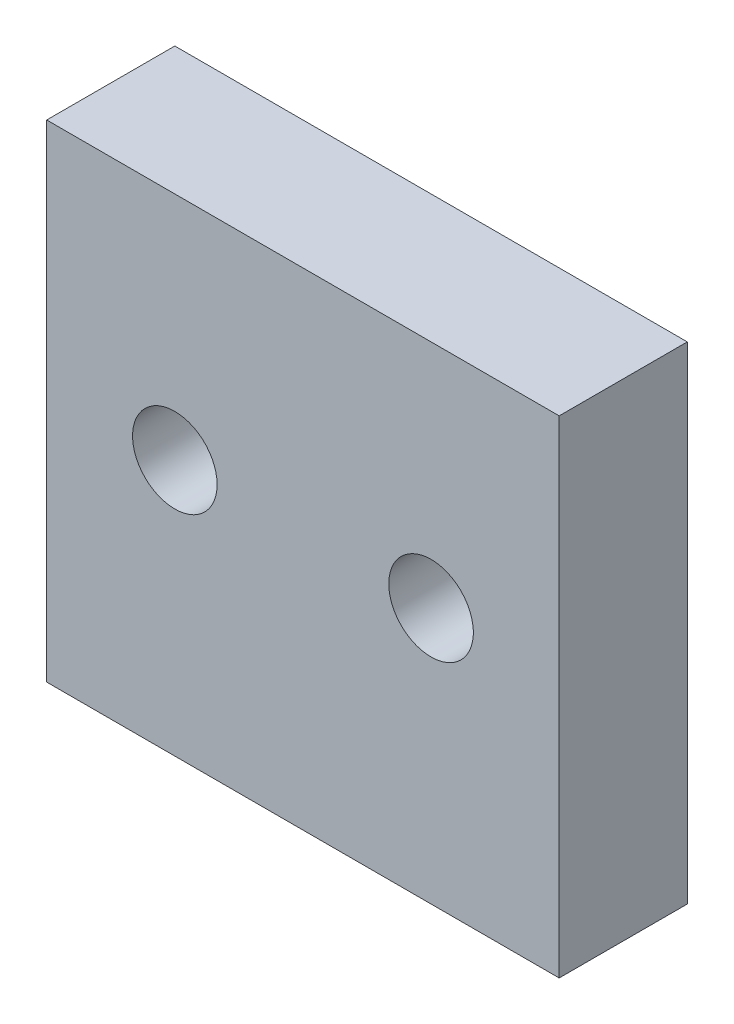
ISO-10303-21;
HEADER;
FILE_DESCRIPTION(('STEP AP214'),'2;1');
FILE_NAME('part.step','',(''),(''),'','','');
FILE_SCHEMA(('AUTOMOTIVE_DESIGN { 1 0 10303 214 1 1 1 1 }'));
ENDSEC;
DATA;
#1=APPLICATION_CONTEXT('core data for automotive mechanical design processes');
#2=APPLICATION_PROTOCOL_DEFINITION('international standard','automotive_design',2000,#1);
#3=PRODUCT_CONTEXT('',#1,'mechanical');
#4=PRODUCT('Part','Part','',(#3));
#5=PRODUCT_RELATED_PRODUCT_CATEGORY('part','',(#4));
#6=PRODUCT_DEFINITION_FORMATION('','',#4);
#7=PRODUCT_DEFINITION_CONTEXT('part definition',#1,'design');
#8=PRODUCT_DEFINITION('design','',#6,#7);
#9=PRODUCT_DEFINITION_SHAPE('','',#8);
#10=(LENGTH_UNIT() NAMED_UNIT(*) SI_UNIT(.MILLI.,.METRE.));
#11=(NAMED_UNIT(*) PLANE_ANGLE_UNIT() SI_UNIT($,.RADIAN.));
#12=(NAMED_UNIT(*) SI_UNIT($,.STERADIAN.) SOLID_ANGLE_UNIT());
#13=UNCERTAINTY_MEASURE_WITH_UNIT(LENGTH_MEASURE(1.E-05),#10,'distance_accuracy_value','');
#14=(GEOMETRIC_REPRESENTATION_CONTEXT(3) GLOBAL_UNCERTAINTY_ASSIGNED_CONTEXT((#13)) GLOBAL_UNIT_ASSIGNED_CONTEXT((#10,
#11,#12)) REPRESENTATION_CONTEXT('',''));
#15=CARTESIAN_POINT('',(0.,0.,0.));
#16=DIRECTION('',(0.,0.,1.));
#17=DIRECTION('',(1.,0.,0.));
#18=AXIS2_PLACEMENT_3D('',#15,#16,#17);
#19=CARTESIAN_POINT('',(0.,0.,5.));
#20=DIRECTION('',(0.,0.,1.));
#21=DIRECTION('',(1.,0.,0.));
#22=AXIS2_PLACEMENT_3D('',#19,#20,#21);
#23=PLANE('',#22);
#24=DIRECTION('',(1.,0.,0.));
#25=VECTOR('',#24,1.);
#26=CARTESIAN_POINT('',(-10.,9.,5.));
#27=LINE('',#26,#25);
#28=CARTESIAN_POINT('',(-10.,9.,5.));
#29=VERTEX_POINT('',#28);
#30=CARTESIAN_POINT('',(10.,9.,5.));
#31=VERTEX_POINT('',#30);
#32=EDGE_CURVE('E117',#29,#31,#27,.T.);
#33=ORIENTED_EDGE('',*,*,#32,.F.);
#34=DIRECTION('',(0.,-1.,0.));
#35=VECTOR('',#34,1.);
#36=CARTESIAN_POINT('',(-10.,10.,5.));
#37=LINE('',#36,#35);
#38=CARTESIAN_POINT('',(-10.,-10.,5.));
#39=VERTEX_POINT('',#38);
#40=EDGE_CURVE('E102',#29,#39,#37,.T.);
#41=ORIENTED_EDGE('',*,*,#40,.T.);
#42=DIRECTION('',(1.,0.,0.));
#43=VECTOR('',#42,1.);
#44=CARTESIAN_POINT('',(-10.,-10.,5.));
#45=LINE('',#44,#43);
#46=CARTESIAN_POINT('',(10.,-10.,5.));
#47=VERTEX_POINT('',#46);
#48=EDGE_CURVE('E65',#39,#47,#45,.T.);
#49=ORIENTED_EDGE('',*,*,#48,.T.);
#50=DIRECTION('',(0.,1.,0.));
#51=VECTOR('',#50,1.);
#52=CARTESIAN_POINT('',(10.,10.,5.));
#53=LINE('',#52,#51);
#54=EDGE_CURVE('E85',#47,#31,#53,.T.);
#55=ORIENTED_EDGE('',*,*,#54,.T.);
#56=EDGE_LOOP('',(#33,#41,#49,#55));
#57=FACE_BOUND('',#56,.T.);
#58=CARTESIAN_POINT('',(-5.,0.,5.));
#59=DIRECTION('',(0.,0.,1.));
#60=DIRECTION('',(1.,0.,0.));
#61=AXIS2_PLACEMENT_3D('',#58,#59,#60);
#62=CIRCLE('',#61,1.65);
#63=CARTESIAN_POINT('',(-3.35,0.,5.));
#64=VERTEX_POINT('',#63);
#65=EDGE_CURVE('E94',#64,#64,#62,.T.);
#66=ORIENTED_EDGE('',*,*,#65,.F.);
#67=EDGE_LOOP('',(#66));
#68=FACE_BOUND('',#67,.T.);
#69=CARTESIAN_POINT('',(5.,0.,5.));
#70=DIRECTION('',(0.,0.,1.));
#71=DIRECTION('',(-1.,0.,0.));
#72=AXIS2_PLACEMENT_3D('',#69,#70,#71);
#73=CIRCLE('',#72,1.65);
#74=CARTESIAN_POINT('',(3.35,0.,5.));
#75=VERTEX_POINT('',#74);
#76=EDGE_CURVE('E106',#75,#75,#73,.T.);
#77=ORIENTED_EDGE('',*,*,#76,.F.);
#78=EDGE_LOOP('',(#77));
#79=FACE_BOUND('',#78,.T.);
#80=ADVANCED_FACE('F41',(#57,#68,#79),#23,.T.);
#81=CARTESIAN_POINT('',(0.,0.,0.));
#82=DIRECTION('',(0.,0.,1.));
#83=DIRECTION('',(1.,0.,0.));
#84=AXIS2_PLACEMENT_3D('',#81,#82,#83);
#85=PLANE('',#84);
#86=DIRECTION('',(0.,-1.,0.));
#87=VECTOR('',#86,1.);
#88=CARTESIAN_POINT('',(-10.,10.,0.));
#89=LINE('',#88,#87);
#90=CARTESIAN_POINT('',(-10.,9.,0.));
#91=VERTEX_POINT('',#90);
#92=CARTESIAN_POINT('',(-10.,-10.,0.));
#93=VERTEX_POINT('',#92);
#94=EDGE_CURVE('E86',#91,#93,#89,.T.);
#95=ORIENTED_EDGE('',*,*,#94,.F.);
#96=DIRECTION('',(1.,0.,0.));
#97=VECTOR('',#96,1.);
#98=CARTESIAN_POINT('',(-10.,9.,0.));
#99=LINE('',#98,#97);
#100=CARTESIAN_POINT('',(10.,9.,0.));
#101=VERTEX_POINT('',#100);
#102=EDGE_CURVE('E56',#91,#101,#99,.T.);
#103=ORIENTED_EDGE('',*,*,#102,.T.);
#104=DIRECTION('',(0.,1.,0.));
#105=VECTOR('',#104,1.);
#106=CARTESIAN_POINT('',(10.,10.,0.));
#107=LINE('',#106,#105);
#108=CARTESIAN_POINT('',(10.,-10.,0.));
#109=VERTEX_POINT('',#108);
#110=EDGE_CURVE('E91',#109,#101,#107,.T.);
#111=ORIENTED_EDGE('',*,*,#110,.F.);
#112=DIRECTION('',(1.,0.,0.));
#113=VECTOR('',#112,1.);
#114=CARTESIAN_POINT('',(-10.,-10.,0.));
#115=LINE('',#114,#113);
#116=EDGE_CURVE('E77',#93,#109,#115,.T.);
#117=ORIENTED_EDGE('',*,*,#116,.F.);
#118=EDGE_LOOP('',(#95,#103,#111,#117));
#119=FACE_BOUND('',#118,.T.);
#120=CARTESIAN_POINT('',(-5.,0.,0.));
#121=DIRECTION('',(0.,0.,1.));
#122=DIRECTION('',(1.,0.,0.));
#123=AXIS2_PLACEMENT_3D('',#120,#121,#122);
#124=CIRCLE('',#123,1.65);
#125=CARTESIAN_POINT('',(-3.35,0.,0.));
#126=VERTEX_POINT('',#125);
#127=EDGE_CURVE('E98',#126,#126,#124,.T.);
#128=ORIENTED_EDGE('',*,*,#127,.T.);
#129=EDGE_LOOP('',(#128));
#130=FACE_BOUND('',#129,.T.);
#131=CARTESIAN_POINT('',(5.,0.,0.));
#132=DIRECTION('',(0.,0.,1.));
#133=DIRECTION('',(-1.,0.,0.));
#134=AXIS2_PLACEMENT_3D('',#131,#132,#133);
#135=CIRCLE('',#134,1.65);
#136=CARTESIAN_POINT('',(3.35,0.,0.));
#137=VERTEX_POINT('',#136);
#138=EDGE_CURVE('E108',#137,#137,#135,.T.);
#139=ORIENTED_EDGE('',*,*,#138,.T.);
#140=EDGE_LOOP('',(#139));
#141=FACE_BOUND('',#140,.T.);
#142=ADVANCED_FACE('F92',(#119,#130,#141),#85,.F.);
#143=CARTESIAN_POINT('',(10.,10.,5.));
#144=DIRECTION('',(-1.,0.,0.));
#145=DIRECTION('',(0.,-1.,0.));
#146=AXIS2_PLACEMENT_3D('',#143,#144,#145);
#147=PLANE('',#146);
#148=ORIENTED_EDGE('',*,*,#110,.T.);
#149=DIRECTION('',(0.,0.,1.));
#150=VECTOR('',#149,1.);
#151=CARTESIAN_POINT('',(10.,9.,0.));
#152=LINE('',#151,#150);
#153=EDGE_CURVE('E111',#101,#31,#152,.T.);
#154=ORIENTED_EDGE('',*,*,#153,.T.);
#155=ORIENTED_EDGE('',*,*,#54,.F.);
#156=DIRECTION('',(0.,0.,-1.));
#157=VECTOR('',#156,1.);
#158=CARTESIAN_POINT('',(10.,-10.,5.));
#159=LINE('',#158,#157);
#160=EDGE_CURVE('E49',#47,#109,#159,.T.);
#161=ORIENTED_EDGE('',*,*,#160,.T.);
#162=EDGE_LOOP('',(#148,#154,#155,#161));
#163=FACE_BOUND('',#162,.T.);
#164=ADVANCED_FACE('F43',(#163),#147,.F.);
#165=CARTESIAN_POINT('',(-10.,10.,5.));
#166=DIRECTION('',(1.,0.,0.));
#167=DIRECTION('',(0.,1.,0.));
#168=AXIS2_PLACEMENT_3D('',#165,#166,#167);
#169=PLANE('',#168);
#170=ORIENTED_EDGE('',*,*,#40,.F.);
#171=DIRECTION('',(0.,0.,1.));
#172=VECTOR('',#171,1.);
#173=CARTESIAN_POINT('',(-10.,9.,0.));
#174=LINE('',#173,#172);
#175=EDGE_CURVE('E114',#91,#29,#174,.T.);
#176=ORIENTED_EDGE('',*,*,#175,.F.);
#177=ORIENTED_EDGE('',*,*,#94,.T.);
#178=DIRECTION('',(0.,0.,-1.));
#179=VECTOR('',#178,1.);
#180=CARTESIAN_POINT('',(-10.,-10.,5.));
#181=LINE('',#180,#179);
#182=EDGE_CURVE('E11',#39,#93,#181,.T.);
#183=ORIENTED_EDGE('',*,*,#182,.F.);
#184=EDGE_LOOP('',(#170,#176,#177,#183));
#185=FACE_BOUND('',#184,.T.);
#186=ADVANCED_FACE('F144',(#185),#169,.F.);
#187=CARTESIAN_POINT('',(-10.,-10.,5.));
#188=DIRECTION('',(0.,1.,0.));
#189=DIRECTION('',(0.,0.,1.));
#190=AXIS2_PLACEMENT_3D('',#187,#188,#189);
#191=PLANE('',#190);
#192=ORIENTED_EDGE('',*,*,#116,.T.);
#193=ORIENTED_EDGE('',*,*,#160,.F.);
#194=ORIENTED_EDGE('',*,*,#48,.F.);
#195=ORIENTED_EDGE('',*,*,#182,.T.);
#196=EDGE_LOOP('',(#192,#193,#194,#195));
#197=FACE_BOUND('',#196,.T.);
#198=ADVANCED_FACE('F79',(#197),#191,.F.);
#199=CARTESIAN_POINT('',(-5.,0.,5.));
#200=DIRECTION('',(0.,0.,-1.));
#201=DIRECTION('',(-1.,0.,0.));
#202=AXIS2_PLACEMENT_3D('',#199,#200,#201);
#203=CYLINDRICAL_SURFACE('',#202,1.65);
#204=ORIENTED_EDGE('',*,*,#65,.T.);
#205=EDGE_LOOP('',(#204));
#206=FACE_BOUND('',#205,.T.);
#207=ORIENTED_EDGE('',*,*,#127,.F.);
#208=EDGE_LOOP('',(#207));
#209=FACE_BOUND('',#208,.T.);
#210=ADVANCED_FACE('F135',(#206,#209),#203,.F.);
#211=CARTESIAN_POINT('',(5.,0.,5.));
#212=DIRECTION('',(0.,0.,-1.));
#213=DIRECTION('',(-1.,0.,0.));
#214=AXIS2_PLACEMENT_3D('',#211,#212,#213);
#215=CYLINDRICAL_SURFACE('',#214,1.65);
#216=ORIENTED_EDGE('',*,*,#76,.T.);
#217=EDGE_LOOP('',(#216));
#218=FACE_BOUND('',#217,.T.);
#219=ORIENTED_EDGE('',*,*,#138,.F.);
#220=EDGE_LOOP('',(#219));
#221=FACE_BOUND('',#220,.T.);
#222=ADVANCED_FACE('F132',(#218,#221),#215,.F.);
#223=CARTESIAN_POINT('',(-10.,9.,0.));
#224=DIRECTION('',(0.,-1.,0.));
#225=DIRECTION('',(0.,0.,-1.));
#226=AXIS2_PLACEMENT_3D('',#223,#224,#225);
#227=PLANE('',#226);
#228=ORIENTED_EDGE('',*,*,#32,.T.);
#229=ORIENTED_EDGE('',*,*,#153,.F.);
#230=ORIENTED_EDGE('',*,*,#102,.F.);
#231=ORIENTED_EDGE('',*,*,#175,.T.);
#232=EDGE_LOOP('',(#228,#229,#230,#231));
#233=FACE_BOUND('',#232,.T.);
#234=ADVANCED_FACE('F122',(#233),#227,.F.);
#235=CLOSED_SHELL('',(#80,#142,#164,#186,#198,#210,#222,#234));
#236=MANIFOLD_SOLID_BREP('B2',#235);
#237=ADVANCED_BREP_SHAPE_REPRESENTATION('',(#18,#236),#14);
#238=SHAPE_DEFINITION_REPRESENTATION(#9,#237);
ENDSEC;
END-ISO-10303-21;
